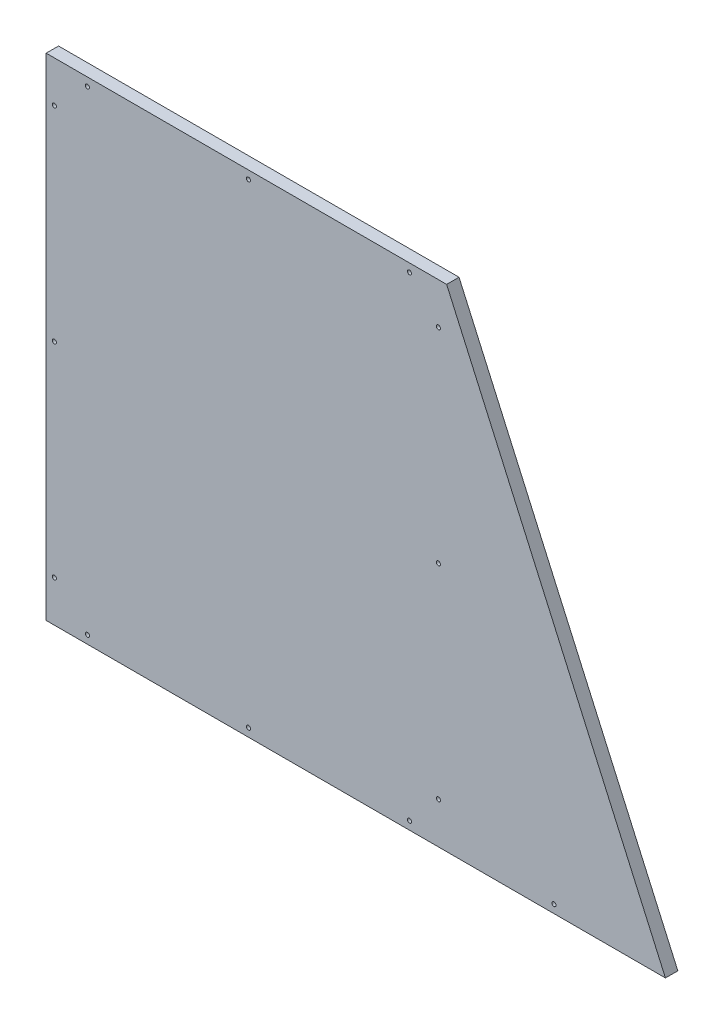
ISO-10303-21;
HEADER;
FILE_DESCRIPTION(('STEP AP214'),'2;1');
FILE_NAME('part.step','',(''),(''),'','','');
FILE_SCHEMA(('AUTOMOTIVE_DESIGN { 1 0 10303 214 1 1 1 1 }'));
ENDSEC;
DATA;
#1=APPLICATION_CONTEXT('core data for automotive mechanical design processes');
#2=APPLICATION_PROTOCOL_DEFINITION('international standard','automotive_design',2000,#1);
#3=PRODUCT_CONTEXT('',#1,'mechanical');
#4=PRODUCT('Part','Part','',(#3));
#5=PRODUCT_RELATED_PRODUCT_CATEGORY('part','',(#4));
#6=PRODUCT_DEFINITION_FORMATION('','',#4);
#7=PRODUCT_DEFINITION_CONTEXT('part definition',#1,'design');
#8=PRODUCT_DEFINITION('design','',#6,#7);
#9=PRODUCT_DEFINITION_SHAPE('','',#8);
#10=(LENGTH_UNIT() NAMED_UNIT(*) SI_UNIT(.MILLI.,.METRE.));
#11=(NAMED_UNIT(*) PLANE_ANGLE_UNIT() SI_UNIT($,.RADIAN.));
#12=(NAMED_UNIT(*) SI_UNIT($,.STERADIAN.) SOLID_ANGLE_UNIT());
#13=UNCERTAINTY_MEASURE_WITH_UNIT(LENGTH_MEASURE(1.E-05),#10,'distance_accuracy_value','');
#14=(GEOMETRIC_REPRESENTATION_CONTEXT(3) GLOBAL_UNCERTAINTY_ASSIGNED_CONTEXT((#13)) GLOBAL_UNIT_ASSIGNED_CONTEXT((#10,
#11,#12)) REPRESENTATION_CONTEXT('',''));
#15=CARTESIAN_POINT('',(0.,0.,0.));
#16=DIRECTION('',(0.,0.,1.));
#17=DIRECTION('',(1.,0.,0.));
#18=AXIS2_PLACEMENT_3D('',#15,#16,#17);
#19=CARTESIAN_POINT('',(242.5,297.5,15.));
#20=DIRECTION('',(-0.913494717392276,-0.406850588418409,0.));
#21=DIRECTION('',(0.406850588418409,-0.913494717392276,0.));
#22=AXIS2_PLACEMENT_3D('',#19,#20,#21);
#23=PLANE('',#22);
#24=DIRECTION('',(-0.406850588418409,0.913494717392276,0.));
#25=VECTOR('',#24,1.);
#26=CARTESIAN_POINT('',(242.5,297.5,0.));
#27=LINE('',#26,#25);
#28=CARTESIAN_POINT('',(507.5,-297.5,0.));
#29=VERTEX_POINT('',#28);
#30=CARTESIAN_POINT('',(242.5,297.5,0.));
#31=VERTEX_POINT('',#30);
#32=EDGE_CURVE('E100',#29,#31,#27,.T.);
#33=ORIENTED_EDGE('',*,*,#32,.T.);
#34=DIRECTION('',(0.,0.,-1.));
#35=VECTOR('',#34,1.);
#36=CARTESIAN_POINT('',(242.5,297.5,15.));
#37=LINE('',#36,#35);
#38=CARTESIAN_POINT('',(242.5,297.5,15.));
#39=VERTEX_POINT('',#38);
#40=EDGE_CURVE('E11',#39,#31,#37,.T.);
#41=ORIENTED_EDGE('',*,*,#40,.F.);
#42=DIRECTION('',(-0.406850588418409,0.913494717392276,0.));
#43=VECTOR('',#42,1.);
#44=CARTESIAN_POINT('',(242.5,297.5,15.));
#45=LINE('',#44,#43);
#46=CARTESIAN_POINT('',(507.5,-297.5,15.));
#47=VERTEX_POINT('',#46);
#48=EDGE_CURVE('E88',#47,#39,#45,.T.);
#49=ORIENTED_EDGE('',*,*,#48,.F.);
#50=DIRECTION('',(0.,0.,-1.));
#51=VECTOR('',#50,1.);
#52=CARTESIAN_POINT('',(507.5,-297.5,15.));
#53=LINE('',#52,#51);
#54=EDGE_CURVE('E96',#47,#29,#53,.T.);
#55=ORIENTED_EDGE('',*,*,#54,.T.);
#56=EDGE_LOOP('',(#33,#41,#49,#55));
#57=FACE_BOUND('',#56,.T.);
#58=ADVANCED_FACE('F37',(#57),#23,.F.);
#59=CARTESIAN_POINT('',(-242.5,297.5,15.));
#60=DIRECTION('',(0.,-1.,0.));
#61=DIRECTION('',(1.,0.,0.));
#62=AXIS2_PLACEMENT_3D('',#59,#60,#61);
#63=PLANE('',#62);
#64=DIRECTION('',(-1.,0.,0.));
#65=VECTOR('',#64,1.);
#66=CARTESIAN_POINT('',(-242.5,297.5,0.));
#67=LINE('',#66,#65);
#68=CARTESIAN_POINT('',(-242.5,297.5,0.));
#69=VERTEX_POINT('',#68);
#70=EDGE_CURVE('E92',#31,#69,#67,.T.);
#71=ORIENTED_EDGE('',*,*,#70,.T.);
#72=DIRECTION('',(0.,0.,-1.));
#73=VECTOR('',#72,1.);
#74=CARTESIAN_POINT('',(-242.5,297.5,15.));
#75=LINE('',#74,#73);
#76=CARTESIAN_POINT('',(-242.5,297.5,15.));
#77=VERTEX_POINT('',#76);
#78=EDGE_CURVE('E45',#77,#69,#75,.T.);
#79=ORIENTED_EDGE('',*,*,#78,.F.);
#80=DIRECTION('',(-1.,0.,0.));
#81=VECTOR('',#80,1.);
#82=CARTESIAN_POINT('',(-242.5,297.5,15.));
#83=LINE('',#82,#81);
#84=EDGE_CURVE('E83',#39,#77,#83,.T.);
#85=ORIENTED_EDGE('',*,*,#84,.F.);
#86=ORIENTED_EDGE('',*,*,#40,.T.);
#87=EDGE_LOOP('',(#71,#79,#85,#86));
#88=FACE_BOUND('',#87,.T.);
#89=ADVANCED_FACE('F91',(#88),#63,.F.);
#90=CARTESIAN_POINT('',(-242.5,297.5,15.));
#91=DIRECTION('',(1.,0.,0.));
#92=DIRECTION('',(0.,1.,0.));
#93=AXIS2_PLACEMENT_3D('',#90,#91,#92);
#94=PLANE('',#93);
#95=DIRECTION('',(0.,-1.,0.));
#96=VECTOR('',#95,1.);
#97=CARTESIAN_POINT('',(-242.5,297.5,0.));
#98=LINE('',#97,#96);
#99=CARTESIAN_POINT('',(-242.5,-297.5,0.));
#100=VERTEX_POINT('',#99);
#101=EDGE_CURVE('E70',#69,#100,#98,.T.);
#102=ORIENTED_EDGE('',*,*,#101,.T.);
#103=DIRECTION('',(0.,0.,-1.));
#104=VECTOR('',#103,1.);
#105=CARTESIAN_POINT('',(-242.5,-297.5,15.));
#106=LINE('',#105,#104);
#107=CARTESIAN_POINT('',(-242.5,-297.5,15.));
#108=VERTEX_POINT('',#107);
#109=EDGE_CURVE('E93',#108,#100,#106,.T.);
#110=ORIENTED_EDGE('',*,*,#109,.F.);
#111=DIRECTION('',(0.,-1.,0.));
#112=VECTOR('',#111,1.);
#113=CARTESIAN_POINT('',(-242.5,297.5,15.));
#114=LINE('',#113,#112);
#115=EDGE_CURVE('E86',#77,#108,#114,.T.);
#116=ORIENTED_EDGE('',*,*,#115,.F.);
#117=ORIENTED_EDGE('',*,*,#78,.T.);
#118=EDGE_LOOP('',(#102,#110,#116,#117));
#119=FACE_BOUND('',#118,.T.);
#120=ADVANCED_FACE('F94',(#119),#94,.F.);
#121=CARTESIAN_POINT('',(-242.5,-297.5,15.));
#122=DIRECTION('',(0.,1.,0.));
#123=DIRECTION('',(0.,0.,1.));
#124=AXIS2_PLACEMENT_3D('',#121,#122,#123);
#125=PLANE('',#124);
#126=DIRECTION('',(1.,0.,0.));
#127=VECTOR('',#126,1.);
#128=CARTESIAN_POINT('',(-242.5,-297.5,0.));
#129=LINE('',#128,#127);
#130=EDGE_CURVE('E76',#100,#29,#129,.T.);
#131=ORIENTED_EDGE('',*,*,#130,.T.);
#132=ORIENTED_EDGE('',*,*,#54,.F.);
#133=DIRECTION('',(1.,0.,0.));
#134=VECTOR('',#133,1.);
#135=CARTESIAN_POINT('',(-242.5,-297.5,15.));
#136=LINE('',#135,#134);
#137=EDGE_CURVE('E53',#108,#47,#136,.T.);
#138=ORIENTED_EDGE('',*,*,#137,.F.);
#139=ORIENTED_EDGE('',*,*,#109,.T.);
#140=EDGE_LOOP('',(#131,#132,#138,#139));
#141=FACE_BOUND('',#140,.T.);
#142=ADVANCED_FACE('F108',(#141),#125,.F.);
#143=CARTESIAN_POINT('',(0.,0.,15.));
#144=DIRECTION('',(0.,0.,1.));
#145=DIRECTION('',(1.,0.,0.));
#146=AXIS2_PLACEMENT_3D('',#143,#144,#145);
#147=PLANE('',#146);
#148=CARTESIAN_POINT('',(372.5,-287.5,15.));
#149=DIRECTION('',(0.,0.,1.));
#150=DIRECTION('',(1.,0.,0.));
#151=AXIS2_PLACEMENT_3D('',#148,#149,#150);
#152=CIRCLE('',#151,2.49999999999997);
#153=CARTESIAN_POINT('',(375.,-287.5,15.));
#154=VERTEX_POINT('',#153);
#155=EDGE_CURVE('E186',#154,#154,#152,.T.);
#156=ORIENTED_EDGE('',*,*,#155,.F.);
#157=EDGE_LOOP('',(#156));
#158=FACE_BOUND('',#157,.T.);
#159=CARTESIAN_POINT('',(232.5,247.5,15.));
#160=DIRECTION('',(0.,0.,-1.));
#161=DIRECTION('',(-1.,0.,0.));
#162=AXIS2_PLACEMENT_3D('',#159,#160,#161);
#163=CIRCLE('',#162,2.50000000000002);
#164=CARTESIAN_POINT('',(230.,247.5,15.));
#165=VERTEX_POINT('',#164);
#166=EDGE_CURVE('E181',#165,#165,#163,.T.);
#167=ORIENTED_EDGE('',*,*,#166,.T.);
#168=EDGE_LOOP('',(#167));
#169=FACE_BOUND('',#168,.T.);
#170=CARTESIAN_POINT('',(232.5,0.,15.));
#171=DIRECTION('',(0.,0.,-1.));
#172=DIRECTION('',(-1.,0.,0.));
#173=AXIS2_PLACEMENT_3D('',#170,#171,#172);
#174=CIRCLE('',#173,2.50000000000002);
#175=CARTESIAN_POINT('',(230.,0.,15.));
#176=VERTEX_POINT('',#175);
#177=EDGE_CURVE('E175',#176,#176,#174,.T.);
#178=ORIENTED_EDGE('',*,*,#177,.T.);
#179=EDGE_LOOP('',(#178));
#180=FACE_BOUND('',#179,.T.);
#181=CARTESIAN_POINT('',(232.5,-247.5,15.));
#182=DIRECTION('',(0.,0.,-1.));
#183=DIRECTION('',(-1.,0.,0.));
#184=AXIS2_PLACEMENT_3D('',#181,#182,#183);
#185=CIRCLE('',#184,2.50000000000002);
#186=CARTESIAN_POINT('',(230.,-247.5,15.));
#187=VERTEX_POINT('',#186);
#188=EDGE_CURVE('E168',#187,#187,#185,.T.);
#189=ORIENTED_EDGE('',*,*,#188,.T.);
#190=EDGE_LOOP('',(#189));
#191=FACE_BOUND('',#190,.T.);
#192=CARTESIAN_POINT('',(-192.5,-287.5,15.));
#193=DIRECTION('',(0.,0.,-1.));
#194=DIRECTION('',(1.,0.,0.));
#195=AXIS2_PLACEMENT_3D('',#192,#193,#194);
#196=CIRCLE('',#195,2.5);
#197=CARTESIAN_POINT('',(-190.,-287.5,15.));
#198=VERTEX_POINT('',#197);
#199=EDGE_CURVE('E163',#198,#198,#196,.T.);
#200=ORIENTED_EDGE('',*,*,#199,.T.);
#201=EDGE_LOOP('',(#200));
#202=FACE_BOUND('',#201,.T.);
#203=CARTESIAN_POINT('',(2.49999999999995,-287.5,15.));
#204=DIRECTION('',(0.,0.,-1.));
#205=DIRECTION('',(1.,0.,0.));
#206=AXIS2_PLACEMENT_3D('',#203,#204,#205);
#207=CIRCLE('',#206,2.5);
#208=CARTESIAN_POINT('',(4.99999999999994,-287.5,15.));
#209=VERTEX_POINT('',#208);
#210=EDGE_CURVE('E157',#209,#209,#207,.T.);
#211=ORIENTED_EDGE('',*,*,#210,.T.);
#212=EDGE_LOOP('',(#211));
#213=FACE_BOUND('',#212,.T.);
#214=CARTESIAN_POINT('',(197.5,-287.5,15.));
#215=DIRECTION('',(0.,0.,-1.));
#216=DIRECTION('',(1.,0.,0.));
#217=AXIS2_PLACEMENT_3D('',#214,#215,#216);
#218=CIRCLE('',#217,2.49999999999985);
#219=CARTESIAN_POINT('',(200.,-287.5,15.));
#220=VERTEX_POINT('',#219);
#221=EDGE_CURVE('E150',#220,#220,#218,.T.);
#222=ORIENTED_EDGE('',*,*,#221,.T.);
#223=EDGE_LOOP('',(#222));
#224=FACE_BOUND('',#223,.T.);
#225=CARTESIAN_POINT('',(-232.5,247.5,15.));
#226=DIRECTION('',(0.,0.,1.));
#227=DIRECTION('',(1.,0.,0.));
#228=AXIS2_PLACEMENT_3D('',#225,#226,#227);
#229=CIRCLE('',#228,2.50000000000002);
#230=CARTESIAN_POINT('',(-230.,247.5,15.));
#231=VERTEX_POINT('',#230);
#232=EDGE_CURVE('E145',#231,#231,#229,.T.);
#233=ORIENTED_EDGE('',*,*,#232,.F.);
#234=EDGE_LOOP('',(#233));
#235=FACE_BOUND('',#234,.T.);
#236=CARTESIAN_POINT('',(-232.5,0.,15.));
#237=DIRECTION('',(0.,0.,1.));
#238=DIRECTION('',(1.,0.,0.));
#239=AXIS2_PLACEMENT_3D('',#236,#237,#238);
#240=CIRCLE('',#239,2.50000000000002);
#241=CARTESIAN_POINT('',(-230.,0.,15.));
#242=VERTEX_POINT('',#241);
#243=EDGE_CURVE('E142',#242,#242,#240,.T.);
#244=ORIENTED_EDGE('',*,*,#243,.F.);
#245=EDGE_LOOP('',(#244));
#246=FACE_BOUND('',#245,.T.);
#247=CARTESIAN_POINT('',(-232.5,-247.5,15.));
#248=DIRECTION('',(0.,0.,1.));
#249=DIRECTION('',(1.,0.,0.));
#250=AXIS2_PLACEMENT_3D('',#247,#248,#249);
#251=CIRCLE('',#250,2.50000000000002);
#252=CARTESIAN_POINT('',(-230.,-247.5,15.));
#253=VERTEX_POINT('',#252);
#254=EDGE_CURVE('E135',#253,#253,#251,.T.);
#255=ORIENTED_EDGE('',*,*,#254,.F.);
#256=EDGE_LOOP('',(#255));
#257=FACE_BOUND('',#256,.T.);
#258=CARTESIAN_POINT('',(-192.5,287.5,15.));
#259=DIRECTION('',(0.,0.,1.));
#260=DIRECTION('',(1.,0.,0.));
#261=AXIS2_PLACEMENT_3D('',#258,#259,#260);
#262=CIRCLE('',#261,2.5);
#263=CARTESIAN_POINT('',(-190.,287.5,15.));
#264=VERTEX_POINT('',#263);
#265=EDGE_CURVE('E127',#264,#264,#262,.T.);
#266=ORIENTED_EDGE('',*,*,#265,.F.);
#267=EDGE_LOOP('',(#266));
#268=FACE_BOUND('',#267,.T.);
#269=CARTESIAN_POINT('',(2.49999999999995,287.5,15.));
#270=DIRECTION('',(0.,0.,1.));
#271=DIRECTION('',(1.,0.,0.));
#272=AXIS2_PLACEMENT_3D('',#269,#270,#271);
#273=CIRCLE('',#272,2.5);
#274=CARTESIAN_POINT('',(4.99999999999994,287.5,15.));
#275=VERTEX_POINT('',#274);
#276=EDGE_CURVE('E124',#275,#275,#273,.T.);
#277=ORIENTED_EDGE('',*,*,#276,.F.);
#278=EDGE_LOOP('',(#277));
#279=FACE_BOUND('',#278,.T.);
#280=CARTESIAN_POINT('',(197.5,287.5,15.));
#281=DIRECTION('',(0.,0.,1.));
#282=DIRECTION('',(1.,0.,0.));
#283=AXIS2_PLACEMENT_3D('',#280,#281,#282);
#284=CIRCLE('',#283,2.49999999999985);
#285=CARTESIAN_POINT('',(200.,287.5,15.));
#286=VERTEX_POINT('',#285);
#287=EDGE_CURVE('E117',#286,#286,#284,.T.);
#288=ORIENTED_EDGE('',*,*,#287,.F.);
#289=EDGE_LOOP('',(#288));
#290=FACE_BOUND('',#289,.T.);
#291=ORIENTED_EDGE('',*,*,#48,.T.);
#292=ORIENTED_EDGE('',*,*,#84,.T.);
#293=ORIENTED_EDGE('',*,*,#115,.T.);
#294=ORIENTED_EDGE('',*,*,#137,.T.);
#295=EDGE_LOOP('',(#291,#292,#293,#294));
#296=FACE_BOUND('',#295,.T.);
#297=ADVANCED_FACE('F84',(#158,#169,#180,#191,#202,#213,#224,#235,#246,#257,#268,#279,#290,
#296),#147,.T.);
#298=CARTESIAN_POINT('',(0.,0.,0.));
#299=DIRECTION('',(0.,0.,1.));
#300=DIRECTION('',(1.,0.,0.));
#301=AXIS2_PLACEMENT_3D('',#298,#299,#300);
#302=PLANE('',#301);
#303=CARTESIAN_POINT('',(372.5,-287.5,0.));
#304=DIRECTION('',(0.,0.,1.));
#305=DIRECTION('',(1.,0.,0.));
#306=AXIS2_PLACEMENT_3D('',#303,#304,#305);
#307=CIRCLE('',#306,2.49999999999997);
#308=CARTESIAN_POINT('',(375.,-287.5,0.));
#309=VERTEX_POINT('',#308);
#310=EDGE_CURVE('E172',#309,#309,#307,.T.);
#311=ORIENTED_EDGE('',*,*,#310,.T.);
#312=EDGE_LOOP('',(#311));
#313=FACE_BOUND('',#312,.T.);
#314=CARTESIAN_POINT('',(232.5,247.5,0.));
#315=DIRECTION('',(0.,0.,-1.));
#316=DIRECTION('',(-1.,0.,0.));
#317=AXIS2_PLACEMENT_3D('',#314,#315,#316);
#318=CIRCLE('',#317,2.50000000000002);
#319=CARTESIAN_POINT('',(230.,247.5,0.));
#320=VERTEX_POINT('',#319);
#321=EDGE_CURVE('E154',#320,#320,#318,.T.);
#322=ORIENTED_EDGE('',*,*,#321,.F.);
#323=EDGE_LOOP('',(#322));
#324=FACE_BOUND('',#323,.T.);
#325=CARTESIAN_POINT('',(232.5,0.,0.));
#326=DIRECTION('',(0.,0.,-1.));
#327=DIRECTION('',(-1.,0.,0.));
#328=AXIS2_PLACEMENT_3D('',#325,#326,#327);
#329=CIRCLE('',#328,2.50000000000002);
#330=CARTESIAN_POINT('',(230.,0.,0.));
#331=VERTEX_POINT('',#330);
#332=EDGE_CURVE('E178',#331,#331,#329,.T.);
#333=ORIENTED_EDGE('',*,*,#332,.F.);
#334=EDGE_LOOP('',(#333));
#335=FACE_BOUND('',#334,.T.);
#336=CARTESIAN_POINT('',(232.5,-247.5,0.));
#337=DIRECTION('',(0.,0.,-1.));
#338=DIRECTION('',(-1.,0.,0.));
#339=AXIS2_PLACEMENT_3D('',#336,#337,#338);
#340=CIRCLE('',#339,2.50000000000002);
#341=CARTESIAN_POINT('',(230.,-247.5,0.));
#342=VERTEX_POINT('',#341);
#343=EDGE_CURVE('E171',#342,#342,#340,.T.);
#344=ORIENTED_EDGE('',*,*,#343,.F.);
#345=EDGE_LOOP('',(#344));
#346=FACE_BOUND('',#345,.T.);
#347=CARTESIAN_POINT('',(-192.5,-287.5,0.));
#348=DIRECTION('',(0.,0.,-1.));
#349=DIRECTION('',(1.,0.,0.));
#350=AXIS2_PLACEMENT_3D('',#347,#348,#349);
#351=CIRCLE('',#350,2.5);
#352=CARTESIAN_POINT('',(-190.,-287.5,0.));
#353=VERTEX_POINT('',#352);
#354=EDGE_CURVE('E136',#353,#353,#351,.T.);
#355=ORIENTED_EDGE('',*,*,#354,.F.);
#356=EDGE_LOOP('',(#355));
#357=FACE_BOUND('',#356,.T.);
#358=CARTESIAN_POINT('',(2.49999999999995,-287.5,0.));
#359=DIRECTION('',(0.,0.,-1.));
#360=DIRECTION('',(1.,0.,0.));
#361=AXIS2_PLACEMENT_3D('',#358,#359,#360);
#362=CIRCLE('',#361,2.5);
#363=CARTESIAN_POINT('',(4.99999999999994,-287.5,0.));
#364=VERTEX_POINT('',#363);
#365=EDGE_CURVE('E160',#364,#364,#362,.T.);
#366=ORIENTED_EDGE('',*,*,#365,.F.);
#367=EDGE_LOOP('',(#366));
#368=FACE_BOUND('',#367,.T.);
#369=CARTESIAN_POINT('',(197.5,-287.5,0.));
#370=DIRECTION('',(0.,0.,-1.));
#371=DIRECTION('',(1.,0.,0.));
#372=AXIS2_PLACEMENT_3D('',#369,#370,#371);
#373=CIRCLE('',#372,2.49999999999985);
#374=CARTESIAN_POINT('',(200.,-287.5,0.));
#375=VERTEX_POINT('',#374);
#376=EDGE_CURVE('E153',#375,#375,#373,.T.);
#377=ORIENTED_EDGE('',*,*,#376,.F.);
#378=EDGE_LOOP('',(#377));
#379=FACE_BOUND('',#378,.T.);
#380=CARTESIAN_POINT('',(-232.5,247.5,0.));
#381=DIRECTION('',(0.,0.,1.));
#382=DIRECTION('',(1.,0.,0.));
#383=AXIS2_PLACEMENT_3D('',#380,#381,#382);
#384=CIRCLE('',#383,2.50000000000002);
#385=CARTESIAN_POINT('',(-230.,247.5,0.));
#386=VERTEX_POINT('',#385);
#387=EDGE_CURVE('E118',#386,#386,#384,.T.);
#388=ORIENTED_EDGE('',*,*,#387,.T.);
#389=EDGE_LOOP('',(#388));
#390=FACE_BOUND('',#389,.T.);
#391=CARTESIAN_POINT('',(-232.5,0.,0.));
#392=DIRECTION('',(0.,0.,1.));
#393=DIRECTION('',(1.,0.,0.));
#394=AXIS2_PLACEMENT_3D('',#391,#392,#393);
#395=CIRCLE('',#394,2.50000000000002);
#396=CARTESIAN_POINT('',(-230.,0.,0.));
#397=VERTEX_POINT('',#396);
#398=EDGE_CURVE('E139',#397,#397,#395,.T.);
#399=ORIENTED_EDGE('',*,*,#398,.T.);
#400=EDGE_LOOP('',(#399));
#401=FACE_BOUND('',#400,.T.);
#402=CARTESIAN_POINT('',(-232.5,-247.5,0.));
#403=DIRECTION('',(0.,0.,1.));
#404=DIRECTION('',(1.,0.,0.));
#405=AXIS2_PLACEMENT_3D('',#402,#403,#404);
#406=CIRCLE('',#405,2.50000000000002);
#407=CARTESIAN_POINT('',(-230.,-247.5,0.));
#408=VERTEX_POINT('',#407);
#409=EDGE_CURVE('E132',#408,#408,#406,.T.);
#410=ORIENTED_EDGE('',*,*,#409,.T.);
#411=EDGE_LOOP('',(#410));
#412=FACE_BOUND('',#411,.T.);
#413=CARTESIAN_POINT('',(-192.5,287.5,0.));
#414=DIRECTION('',(0.,0.,1.));
#415=DIRECTION('',(1.,0.,0.));
#416=AXIS2_PLACEMENT_3D('',#413,#414,#415);
#417=CIRCLE('',#416,2.5);
#418=CARTESIAN_POINT('',(-190.,287.5,0.));
#419=VERTEX_POINT('',#418);
#420=EDGE_CURVE('E103',#419,#419,#417,.T.);
#421=ORIENTED_EDGE('',*,*,#420,.T.);
#422=EDGE_LOOP('',(#421));
#423=FACE_BOUND('',#422,.T.);
#424=CARTESIAN_POINT('',(2.49999999999995,287.5,0.));
#425=DIRECTION('',(0.,0.,1.));
#426=DIRECTION('',(1.,0.,0.));
#427=AXIS2_PLACEMENT_3D('',#424,#425,#426);
#428=CIRCLE('',#427,2.5);
#429=CARTESIAN_POINT('',(4.99999999999994,287.5,0.));
#430=VERTEX_POINT('',#429);
#431=EDGE_CURVE('E121',#430,#430,#428,.T.);
#432=ORIENTED_EDGE('',*,*,#431,.T.);
#433=EDGE_LOOP('',(#432));
#434=FACE_BOUND('',#433,.T.);
#435=CARTESIAN_POINT('',(197.5,287.5,0.));
#436=DIRECTION('',(0.,0.,1.));
#437=DIRECTION('',(1.,0.,0.));
#438=AXIS2_PLACEMENT_3D('',#435,#436,#437);
#439=CIRCLE('',#438,2.49999999999985);
#440=CARTESIAN_POINT('',(200.,287.5,0.));
#441=VERTEX_POINT('',#440);
#442=EDGE_CURVE('E114',#441,#441,#439,.T.);
#443=ORIENTED_EDGE('',*,*,#442,.T.);
#444=EDGE_LOOP('',(#443));
#445=FACE_BOUND('',#444,.T.);
#446=ORIENTED_EDGE('',*,*,#32,.F.);
#447=ORIENTED_EDGE('',*,*,#130,.F.);
#448=ORIENTED_EDGE('',*,*,#101,.F.);
#449=ORIENTED_EDGE('',*,*,#70,.F.);
#450=EDGE_LOOP('',(#446,#447,#448,#449));
#451=FACE_BOUND('',#450,.T.);
#452=ADVANCED_FACE('F111',(#313,#324,#335,#346,#357,#368,#379,#390,#401,#412,#423,#434,#445,
#451),#302,.F.);
#453=CARTESIAN_POINT('',(197.5,287.5,0.));
#454=DIRECTION('',(0.,0.,1.));
#455=DIRECTION('',(1.,0.,0.));
#456=AXIS2_PLACEMENT_3D('',#453,#454,#455);
#457=CYLINDRICAL_SURFACE('',#456,2.49999999999985);
#458=ORIENTED_EDGE('',*,*,#442,.F.);
#459=EDGE_LOOP('',(#458));
#460=FACE_BOUND('',#459,.T.);
#461=ORIENTED_EDGE('',*,*,#287,.T.);
#462=EDGE_LOOP('',(#461));
#463=FACE_BOUND('',#462,.T.);
#464=ADVANCED_FACE('F228',(#460,#463),#457,.F.);
#465=CARTESIAN_POINT('',(2.49999999999995,287.5,0.));
#466=DIRECTION('',(0.,0.,1.));
#467=DIRECTION('',(1.,0.,0.));
#468=AXIS2_PLACEMENT_3D('',#465,#466,#467);
#469=CYLINDRICAL_SURFACE('',#468,2.5);
#470=ORIENTED_EDGE('',*,*,#431,.F.);
#471=EDGE_LOOP('',(#470));
#472=FACE_BOUND('',#471,.T.);
#473=ORIENTED_EDGE('',*,*,#276,.T.);
#474=EDGE_LOOP('',(#473));
#475=FACE_BOUND('',#474,.T.);
#476=ADVANCED_FACE('F230',(#472,#475),#469,.F.);
#477=CARTESIAN_POINT('',(-192.5,287.5,0.));
#478=DIRECTION('',(0.,0.,1.));
#479=DIRECTION('',(1.,0.,0.));
#480=AXIS2_PLACEMENT_3D('',#477,#478,#479);
#481=CYLINDRICAL_SURFACE('',#480,2.5);
#482=ORIENTED_EDGE('',*,*,#420,.F.);
#483=EDGE_LOOP('',(#482));
#484=FACE_BOUND('',#483,.T.);
#485=ORIENTED_EDGE('',*,*,#265,.T.);
#486=EDGE_LOOP('',(#485));
#487=FACE_BOUND('',#486,.T.);
#488=ADVANCED_FACE('F237',(#484,#487),#481,.F.);
#489=CARTESIAN_POINT('',(-232.5,-247.5,0.));
#490=DIRECTION('',(0.,0.,1.));
#491=DIRECTION('',(1.,0.,0.));
#492=AXIS2_PLACEMENT_3D('',#489,#490,#491);
#493=CYLINDRICAL_SURFACE('',#492,2.50000000000002);
#494=ORIENTED_EDGE('',*,*,#409,.F.);
#495=EDGE_LOOP('',(#494));
#496=FACE_BOUND('',#495,.T.);
#497=ORIENTED_EDGE('',*,*,#254,.T.);
#498=EDGE_LOOP('',(#497));
#499=FACE_BOUND('',#498,.T.);
#500=ADVANCED_FACE('F337',(#496,#499),#493,.F.);
#501=CARTESIAN_POINT('',(-232.5,0.,0.));
#502=DIRECTION('',(0.,0.,1.));
#503=DIRECTION('',(1.,0.,0.));
#504=AXIS2_PLACEMENT_3D('',#501,#502,#503);
#505=CYLINDRICAL_SURFACE('',#504,2.50000000000002);
#506=ORIENTED_EDGE('',*,*,#398,.F.);
#507=EDGE_LOOP('',(#506));
#508=FACE_BOUND('',#507,.T.);
#509=ORIENTED_EDGE('',*,*,#243,.T.);
#510=EDGE_LOOP('',(#509));
#511=FACE_BOUND('',#510,.T.);
#512=ADVANCED_FACE('F329',(#508,#511),#505,.F.);
#513=CARTESIAN_POINT('',(-232.5,247.5,0.));
#514=DIRECTION('',(0.,0.,1.));
#515=DIRECTION('',(1.,0.,0.));
#516=AXIS2_PLACEMENT_3D('',#513,#514,#515);
#517=CYLINDRICAL_SURFACE('',#516,2.50000000000002);
#518=ORIENTED_EDGE('',*,*,#387,.F.);
#519=EDGE_LOOP('',(#518));
#520=FACE_BOUND('',#519,.T.);
#521=ORIENTED_EDGE('',*,*,#232,.T.);
#522=EDGE_LOOP('',(#521));
#523=FACE_BOUND('',#522,.T.);
#524=ADVANCED_FACE('F321',(#520,#523),#517,.F.);
#525=CARTESIAN_POINT('',(197.5,-287.5,0.));
#526=DIRECTION('',(0.,0.,1.));
#527=DIRECTION('',(1.,0.,0.));
#528=AXIS2_PLACEMENT_3D('',#525,#526,#527);
#529=CYLINDRICAL_SURFACE('',#528,2.49999999999985);
#530=ORIENTED_EDGE('',*,*,#376,.T.);
#531=EDGE_LOOP('',(#530));
#532=FACE_BOUND('',#531,.T.);
#533=ORIENTED_EDGE('',*,*,#221,.F.);
#534=EDGE_LOOP('',(#533));
#535=FACE_BOUND('',#534,.T.);
#536=ADVANCED_FACE('F313',(#532,#535),#529,.F.);
#537=CARTESIAN_POINT('',(2.49999999999995,-287.5,0.));
#538=DIRECTION('',(0.,0.,1.));
#539=DIRECTION('',(1.,0.,0.));
#540=AXIS2_PLACEMENT_3D('',#537,#538,#539);
#541=CYLINDRICAL_SURFACE('',#540,2.5);
#542=ORIENTED_EDGE('',*,*,#365,.T.);
#543=EDGE_LOOP('',(#542));
#544=FACE_BOUND('',#543,.T.);
#545=ORIENTED_EDGE('',*,*,#210,.F.);
#546=EDGE_LOOP('',(#545));
#547=FACE_BOUND('',#546,.T.);
#548=ADVANCED_FACE('F305',(#544,#547),#541,.F.);
#549=CARTESIAN_POINT('',(-192.5,-287.5,0.));
#550=DIRECTION('',(0.,0.,1.));
#551=DIRECTION('',(1.,0.,0.));
#552=AXIS2_PLACEMENT_3D('',#549,#550,#551);
#553=CYLINDRICAL_SURFACE('',#552,2.5);
#554=ORIENTED_EDGE('',*,*,#354,.T.);
#555=EDGE_LOOP('',(#554));
#556=FACE_BOUND('',#555,.T.);
#557=ORIENTED_EDGE('',*,*,#199,.F.);
#558=EDGE_LOOP('',(#557));
#559=FACE_BOUND('',#558,.T.);
#560=ADVANCED_FACE('F297',(#556,#559),#553,.F.);
#561=CARTESIAN_POINT('',(232.5,-247.5,0.));
#562=DIRECTION('',(0.,0.,1.));
#563=DIRECTION('',(1.,0.,0.));
#564=AXIS2_PLACEMENT_3D('',#561,#562,#563);
#565=CYLINDRICAL_SURFACE('',#564,2.50000000000002);
#566=ORIENTED_EDGE('',*,*,#343,.T.);
#567=EDGE_LOOP('',(#566));
#568=FACE_BOUND('',#567,.T.);
#569=ORIENTED_EDGE('',*,*,#188,.F.);
#570=EDGE_LOOP('',(#569));
#571=FACE_BOUND('',#570,.T.);
#572=ADVANCED_FACE('F289',(#568,#571),#565,.F.);
#573=CARTESIAN_POINT('',(232.5,0.,0.));
#574=DIRECTION('',(0.,0.,1.));
#575=DIRECTION('',(1.,0.,0.));
#576=AXIS2_PLACEMENT_3D('',#573,#574,#575);
#577=CYLINDRICAL_SURFACE('',#576,2.50000000000002);
#578=ORIENTED_EDGE('',*,*,#332,.T.);
#579=EDGE_LOOP('',(#578));
#580=FACE_BOUND('',#579,.T.);
#581=ORIENTED_EDGE('',*,*,#177,.F.);
#582=EDGE_LOOP('',(#581));
#583=FACE_BOUND('',#582,.T.);
#584=ADVANCED_FACE('F282',(#580,#583),#577,.F.);
#585=CARTESIAN_POINT('',(232.5,247.5,0.));
#586=DIRECTION('',(0.,0.,1.));
#587=DIRECTION('',(1.,0.,0.));
#588=AXIS2_PLACEMENT_3D('',#585,#586,#587);
#589=CYLINDRICAL_SURFACE('',#588,2.50000000000002);
#590=ORIENTED_EDGE('',*,*,#321,.T.);
#591=EDGE_LOOP('',(#590));
#592=FACE_BOUND('',#591,.T.);
#593=ORIENTED_EDGE('',*,*,#166,.F.);
#594=EDGE_LOOP('',(#593));
#595=FACE_BOUND('',#594,.T.);
#596=ADVANCED_FACE('F197',(#592,#595),#589,.F.);
#597=CARTESIAN_POINT('',(372.5,-287.5,0.));
#598=DIRECTION('',(0.,0.,1.));
#599=DIRECTION('',(1.,0.,0.));
#600=AXIS2_PLACEMENT_3D('',#597,#598,#599);
#601=CYLINDRICAL_SURFACE('',#600,2.49999999999997);
#602=ORIENTED_EDGE('',*,*,#310,.F.);
#603=EDGE_LOOP('',(#602));
#604=FACE_BOUND('',#603,.T.);
#605=ORIENTED_EDGE('',*,*,#155,.T.);
#606=EDGE_LOOP('',(#605));
#607=FACE_BOUND('',#606,.T.);
#608=ADVANCED_FACE('F194',(#604,#607),#601,.F.);
#609=CLOSED_SHELL('',(#58,#89,#120,#142,#297,#452,#464,#476,#488,#500,#512,#524,#536,#548,#560,
#572,#584,#596,#608));
#610=MANIFOLD_SOLID_BREP('B2',#609);
#611=ADVANCED_BREP_SHAPE_REPRESENTATION('',(#18,#610),#14);
#612=SHAPE_DEFINITION_REPRESENTATION(#9,#611);
ENDSEC;
END-ISO-10303-21;
